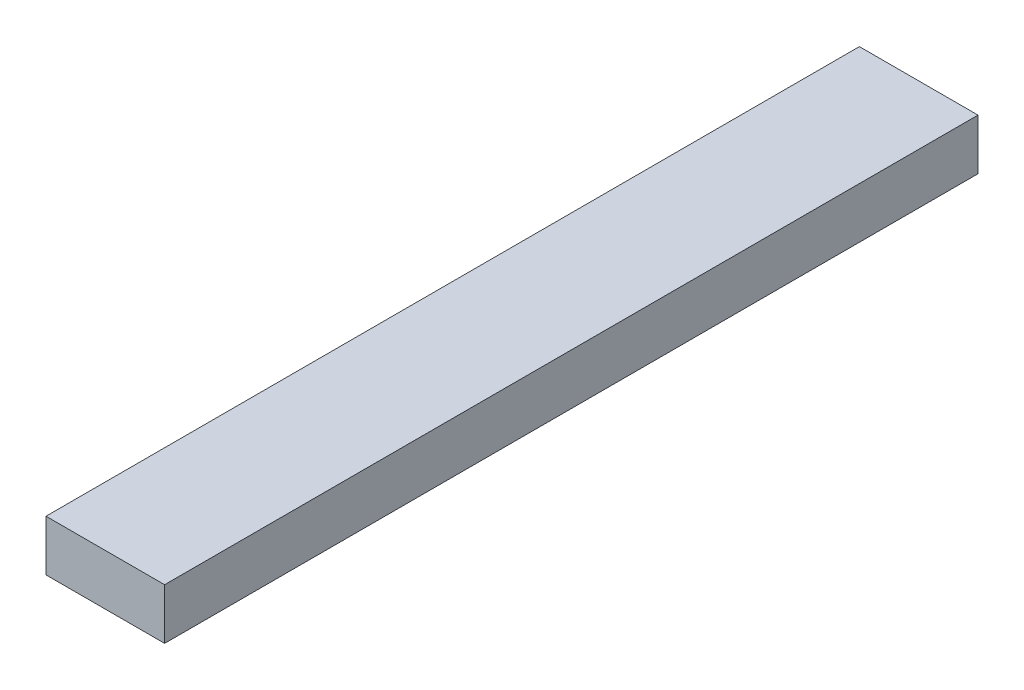
ISO-10303-21;
HEADER;
FILE_DESCRIPTION(('STEP AP214'),'2;1');
FILE_NAME('part.step','',(''),(''),'','','');
FILE_SCHEMA(('AUTOMOTIVE_DESIGN { 1 0 10303 214 1 1 1 1 }'));
ENDSEC;
DATA;
#1=APPLICATION_CONTEXT('core data for automotive mechanical design processes');
#2=APPLICATION_PROTOCOL_DEFINITION('international standard','automotive_design',2000,#1);
#3=PRODUCT_CONTEXT('',#1,'mechanical');
#4=PRODUCT('Part','Part','',(#3));
#5=PRODUCT_RELATED_PRODUCT_CATEGORY('part','',(#4));
#6=PRODUCT_DEFINITION_FORMATION('','',#4);
#7=PRODUCT_DEFINITION_CONTEXT('part definition',#1,'design');
#8=PRODUCT_DEFINITION('design','',#6,#7);
#9=PRODUCT_DEFINITION_SHAPE('','',#8);
#10=(LENGTH_UNIT() NAMED_UNIT(*) SI_UNIT(.MILLI.,.METRE.));
#11=(NAMED_UNIT(*) PLANE_ANGLE_UNIT() SI_UNIT($,.RADIAN.));
#12=(NAMED_UNIT(*) SI_UNIT($,.STERADIAN.) SOLID_ANGLE_UNIT());
#13=UNCERTAINTY_MEASURE_WITH_UNIT(LENGTH_MEASURE(1.E-05),#10,'distance_accuracy_value','');
#14=(GEOMETRIC_REPRESENTATION_CONTEXT(3) GLOBAL_UNCERTAINTY_ASSIGNED_CONTEXT((#13)) GLOBAL_UNIT_ASSIGNED_CONTEXT((#10,
#11,#12)) REPRESENTATION_CONTEXT('',''));
#15=CARTESIAN_POINT('',(0.,0.,0.));
#16=DIRECTION('',(0.,0.,1.));
#17=DIRECTION('',(1.,0.,0.));
#18=AXIS2_PLACEMENT_3D('',#15,#16,#17);
#19=CARTESIAN_POINT('',(44.45,-19.05,304.8));
#20=DIRECTION('',(-1.,0.,0.));
#21=DIRECTION('',(0.,0.,1.));
#22=AXIS2_PLACEMENT_3D('',#19,#20,#21);
#23=PLANE('',#22);
#24=DIRECTION('',(0.,1.,0.));
#25=VECTOR('',#24,1.);
#26=CARTESIAN_POINT('',(44.45,-19.05,-304.8));
#27=LINE('',#26,#25);
#28=CARTESIAN_POINT('',(44.45,-19.05,-304.8));
#29=VERTEX_POINT('',#28);
#30=CARTESIAN_POINT('',(44.45,19.05,-304.8));
#31=VERTEX_POINT('',#30);
#32=EDGE_CURVE('E107',#29,#31,#27,.T.);
#33=ORIENTED_EDGE('',*,*,#32,.T.);
#34=DIRECTION('',(0.,0.,-1.));
#35=VECTOR('',#34,1.);
#36=CARTESIAN_POINT('',(44.45,19.05,304.8));
#37=LINE('',#36,#35);
#38=CARTESIAN_POINT('',(44.45,19.05,304.8));
#39=VERTEX_POINT('',#38);
#40=EDGE_CURVE('E11',#39,#31,#37,.T.);
#41=ORIENTED_EDGE('',*,*,#40,.F.);
#42=DIRECTION('',(0.,1.,0.));
#43=VECTOR('',#42,1.);
#44=CARTESIAN_POINT('',(44.45,-19.05,304.8));
#45=LINE('',#44,#43);
#46=CARTESIAN_POINT('',(44.45,-19.05,304.8));
#47=VERTEX_POINT('',#46);
#48=EDGE_CURVE('E91',#47,#39,#45,.T.);
#49=ORIENTED_EDGE('',*,*,#48,.F.);
#50=DIRECTION('',(0.,0.,-1.));
#51=VECTOR('',#50,1.);
#52=CARTESIAN_POINT('',(44.45,-19.05,304.8));
#53=LINE('',#52,#51);
#54=EDGE_CURVE('E103',#47,#29,#53,.T.);
#55=ORIENTED_EDGE('',*,*,#54,.T.);
#56=EDGE_LOOP('',(#33,#41,#49,#55));
#57=FACE_BOUND('',#56,.T.);
#58=ADVANCED_FACE('F39',(#57),#23,.F.);
#59=CARTESIAN_POINT('',(-44.45,19.05,304.8));
#60=DIRECTION('',(0.,-1.,0.));
#61=DIRECTION('',(0.,0.,-1.));
#62=AXIS2_PLACEMENT_3D('',#59,#60,#61);
#63=PLANE('',#62);
#64=DIRECTION('',(-1.,0.,0.));
#65=VECTOR('',#64,1.);
#66=CARTESIAN_POINT('',(-44.45,19.05,-304.8));
#67=LINE('',#66,#65);
#68=CARTESIAN_POINT('',(-44.45,19.05,-304.8));
#69=VERTEX_POINT('',#68);
#70=EDGE_CURVE('E96',#31,#69,#67,.T.);
#71=ORIENTED_EDGE('',*,*,#70,.T.);
#72=DIRECTION('',(0.,0.,-1.));
#73=VECTOR('',#72,1.);
#74=CARTESIAN_POINT('',(-44.45,19.05,304.8));
#75=LINE('',#74,#73);
#76=CARTESIAN_POINT('',(-44.45,19.05,304.8));
#77=VERTEX_POINT('',#76);
#78=EDGE_CURVE('E48',#77,#69,#75,.T.);
#79=ORIENTED_EDGE('',*,*,#78,.F.);
#80=DIRECTION('',(-1.,0.,0.));
#81=VECTOR('',#80,1.);
#82=CARTESIAN_POINT('',(-44.45,19.05,304.8));
#83=LINE('',#82,#81);
#84=EDGE_CURVE('E86',#39,#77,#83,.T.);
#85=ORIENTED_EDGE('',*,*,#84,.F.);
#86=ORIENTED_EDGE('',*,*,#40,.T.);
#87=EDGE_LOOP('',(#71,#79,#85,#86));
#88=FACE_BOUND('',#87,.T.);
#89=ADVANCED_FACE('F95',(#88),#63,.F.);
#90=CARTESIAN_POINT('',(-44.45,-19.05,304.8));
#91=DIRECTION('',(1.,0.,0.));
#92=DIRECTION('',(0.,0.,-1.));
#93=AXIS2_PLACEMENT_3D('',#90,#91,#92);
#94=PLANE('',#93);
#95=DIRECTION('',(0.,-1.,0.));
#96=VECTOR('',#95,1.);
#97=CARTESIAN_POINT('',(-44.45,-19.05,-304.8));
#98=LINE('',#97,#96);
#99=CARTESIAN_POINT('',(-44.45,-19.05,-304.8));
#100=VERTEX_POINT('',#99);
#101=EDGE_CURVE('E73',#69,#100,#98,.T.);
#102=ORIENTED_EDGE('',*,*,#101,.T.);
#103=DIRECTION('',(0.,0.,-1.));
#104=VECTOR('',#103,1.);
#105=CARTESIAN_POINT('',(-44.45,-19.05,304.8));
#106=LINE('',#105,#104);
#107=CARTESIAN_POINT('',(-44.45,-19.05,304.8));
#108=VERTEX_POINT('',#107);
#109=EDGE_CURVE('E98',#108,#100,#106,.T.);
#110=ORIENTED_EDGE('',*,*,#109,.F.);
#111=DIRECTION('',(0.,-1.,0.));
#112=VECTOR('',#111,1.);
#113=CARTESIAN_POINT('',(-44.45,-19.05,304.8));
#114=LINE('',#113,#112);
#115=EDGE_CURVE('E89',#77,#108,#114,.T.);
#116=ORIENTED_EDGE('',*,*,#115,.F.);
#117=ORIENTED_EDGE('',*,*,#78,.T.);
#118=EDGE_LOOP('',(#102,#110,#116,#117));
#119=FACE_BOUND('',#118,.T.);
#120=ADVANCED_FACE('F99',(#119),#94,.F.);
#121=CARTESIAN_POINT('',(-44.45,-19.05,304.8));
#122=DIRECTION('',(0.,1.,0.));
#123=DIRECTION('',(0.,0.,1.));
#124=AXIS2_PLACEMENT_3D('',#121,#122,#123);
#125=PLANE('',#124);
#126=DIRECTION('',(1.,0.,0.));
#127=VECTOR('',#126,1.);
#128=CARTESIAN_POINT('',(-44.45,-19.05,-304.8));
#129=LINE('',#128,#127);
#130=EDGE_CURVE('E79',#100,#29,#129,.T.);
#131=ORIENTED_EDGE('',*,*,#130,.T.);
#132=ORIENTED_EDGE('',*,*,#54,.F.);
#133=DIRECTION('',(1.,0.,0.));
#134=VECTOR('',#133,1.);
#135=CARTESIAN_POINT('',(-44.45,-19.05,304.8));
#136=LINE('',#135,#134);
#137=EDGE_CURVE('E56',#108,#47,#136,.T.);
#138=ORIENTED_EDGE('',*,*,#137,.F.);
#139=ORIENTED_EDGE('',*,*,#109,.T.);
#140=EDGE_LOOP('',(#131,#132,#138,#139));
#141=FACE_BOUND('',#140,.T.);
#142=ADVANCED_FACE('F120',(#141),#125,.F.);
#143=CARTESIAN_POINT('',(0.,0.,304.8));
#144=DIRECTION('',(0.,0.,-1.));
#145=DIRECTION('',(-1.,0.,0.));
#146=AXIS2_PLACEMENT_3D('',#143,#144,#145);
#147=PLANE('',#146);
#148=ORIENTED_EDGE('',*,*,#48,.T.);
#149=ORIENTED_EDGE('',*,*,#84,.T.);
#150=ORIENTED_EDGE('',*,*,#115,.T.);
#151=ORIENTED_EDGE('',*,*,#137,.T.);
#152=EDGE_LOOP('',(#148,#149,#150,#151));
#153=FACE_BOUND('',#152,.T.);
#154=ADVANCED_FACE('F87',(#153),#147,.F.);
#155=CARTESIAN_POINT('',(0.,0.,-304.8));
#156=DIRECTION('',(0.,0.,-1.));
#157=DIRECTION('',(-1.,0.,0.));
#158=AXIS2_PLACEMENT_3D('',#155,#156,#157);
#159=PLANE('',#158);
#160=ORIENTED_EDGE('',*,*,#32,.F.);
#161=ORIENTED_EDGE('',*,*,#130,.F.);
#162=ORIENTED_EDGE('',*,*,#101,.F.);
#163=ORIENTED_EDGE('',*,*,#70,.F.);
#164=EDGE_LOOP('',(#160,#161,#162,#163));
#165=FACE_BOUND('',#164,.T.);
#166=ADVANCED_FACE('F123',(#165),#159,.T.);
#167=CLOSED_SHELL('',(#58,#89,#120,#142,#154,#166));
#168=MANIFOLD_SOLID_BREP('B2',#167);
#169=ADVANCED_BREP_SHAPE_REPRESENTATION('',(#18,#168),#14);
#170=SHAPE_DEFINITION_REPRESENTATION(#9,#169);
ENDSEC;
END-ISO-10303-21;
